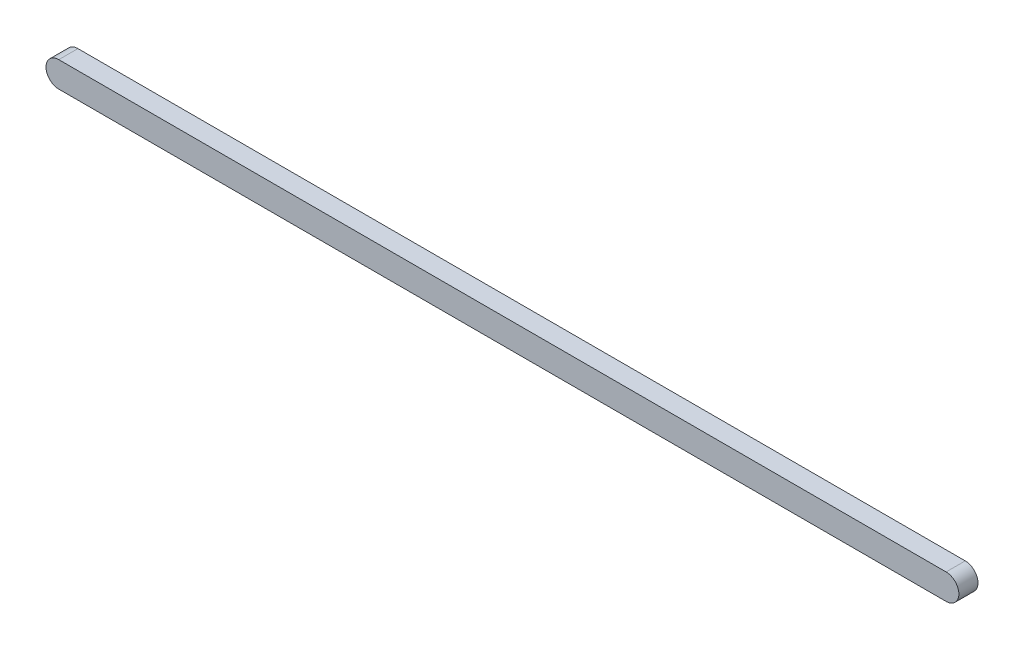
ISO-10303-21;
HEADER;
FILE_DESCRIPTION(('STEP AP214'),'2;1');
FILE_NAME('part.step','',(''),(''),'','','');
FILE_SCHEMA(('AUTOMOTIVE_DESIGN { 1 0 10303 214 1 1 1 1 }'));
ENDSEC;
DATA;
#1=APPLICATION_CONTEXT('core data for automotive mechanical design processes');
#2=APPLICATION_PROTOCOL_DEFINITION('international standard','automotive_design',2000,#1);
#3=PRODUCT_CONTEXT('',#1,'mechanical');
#4=PRODUCT('Part','Part','',(#3));
#5=PRODUCT_RELATED_PRODUCT_CATEGORY('part','',(#4));
#6=PRODUCT_DEFINITION_FORMATION('','',#4);
#7=PRODUCT_DEFINITION_CONTEXT('part definition',#1,'design');
#8=PRODUCT_DEFINITION('design','',#6,#7);
#9=PRODUCT_DEFINITION_SHAPE('','',#8);
#10=(LENGTH_UNIT() NAMED_UNIT(*) SI_UNIT(.MILLI.,.METRE.));
#11=(NAMED_UNIT(*) PLANE_ANGLE_UNIT() SI_UNIT($,.RADIAN.));
#12=(NAMED_UNIT(*) SI_UNIT($,.STERADIAN.) SOLID_ANGLE_UNIT());
#13=UNCERTAINTY_MEASURE_WITH_UNIT(LENGTH_MEASURE(1.E-05),#10,'distance_accuracy_value','');
#14=(GEOMETRIC_REPRESENTATION_CONTEXT(3) GLOBAL_UNCERTAINTY_ASSIGNED_CONTEXT((#13)) GLOBAL_UNIT_ASSIGNED_CONTEXT((#10,
#11,#12)) REPRESENTATION_CONTEXT('',''));
#15=CARTESIAN_POINT('',(0.,0.,0.));
#16=DIRECTION('',(0.,0.,1.));
#17=DIRECTION('',(1.,0.,0.));
#18=AXIS2_PLACEMENT_3D('',#15,#16,#17);
#19=CARTESIAN_POINT('',(0.,2.,3.));
#20=DIRECTION('',(0.,0.,-1.));
#21=DIRECTION('',(-1.,0.,0.));
#22=AXIS2_PLACEMENT_3D('',#19,#20,#21);
#23=CYLINDRICAL_SURFACE('',#22,2.);
#24=CARTESIAN_POINT('',(0.,2.,0.));
#25=DIRECTION('',(0.,0.,1.));
#26=DIRECTION('',(1.,0.,0.));
#27=AXIS2_PLACEMENT_3D('',#24,#25,#26);
#28=CIRCLE('',#27,2.);
#29=CARTESIAN_POINT('',(0.,4.,0.));
#30=VERTEX_POINT('',#29);
#31=CARTESIAN_POINT('',(0.,0.,0.));
#32=VERTEX_POINT('',#31);
#33=EDGE_CURVE('E101',#30,#32,#28,.T.);
#34=ORIENTED_EDGE('',*,*,#33,.T.);
#35=DIRECTION('',(0.,0.,-1.));
#36=VECTOR('',#35,1.);
#37=CARTESIAN_POINT('',(0.,0.,3.));
#38=LINE('',#37,#36);
#39=CARTESIAN_POINT('',(0.,0.,3.));
#40=VERTEX_POINT('',#39);
#41=EDGE_CURVE('E11',#40,#32,#38,.T.);
#42=ORIENTED_EDGE('',*,*,#41,.F.);
#43=CARTESIAN_POINT('',(0.,2.,3.));
#44=DIRECTION('',(0.,0.,1.));
#45=DIRECTION('',(1.,0.,0.));
#46=AXIS2_PLACEMENT_3D('',#43,#44,#45);
#47=CIRCLE('',#46,2.);
#48=CARTESIAN_POINT('',(0.,4.,3.));
#49=VERTEX_POINT('',#48);
#50=EDGE_CURVE('E88',#49,#40,#47,.T.);
#51=ORIENTED_EDGE('',*,*,#50,.F.);
#52=DIRECTION('',(0.,0.,-1.));
#53=VECTOR('',#52,1.);
#54=CARTESIAN_POINT('',(0.,4.,3.));
#55=LINE('',#54,#53);
#56=EDGE_CURVE('E97',#49,#30,#55,.T.);
#57=ORIENTED_EDGE('',*,*,#56,.T.);
#58=EDGE_LOOP('',(#34,#42,#51,#57));
#59=FACE_BOUND('',#58,.T.);
#60=ADVANCED_FACE('F35',(#59),#23,.T.);
#61=CARTESIAN_POINT('',(0.,0.,3.));
#62=DIRECTION('',(0.,1.,0.));
#63=DIRECTION('',(0.,0.,1.));
#64=AXIS2_PLACEMENT_3D('',#61,#62,#63);
#65=PLANE('',#64);
#66=DIRECTION('',(1.,0.,0.));
#67=VECTOR('',#66,1.);
#68=CARTESIAN_POINT('',(0.,0.,0.));
#69=LINE('',#68,#67);
#70=CARTESIAN_POINT('',(139.,0.,0.));
#71=VERTEX_POINT('',#70);
#72=EDGE_CURVE('E92',#32,#71,#69,.T.);
#73=ORIENTED_EDGE('',*,*,#72,.T.);
#74=DIRECTION('',(0.,0.,-1.));
#75=VECTOR('',#74,1.);
#76=CARTESIAN_POINT('',(139.,0.,3.));
#77=LINE('',#76,#75);
#78=CARTESIAN_POINT('',(139.,0.,3.));
#79=VERTEX_POINT('',#78);
#80=EDGE_CURVE('E44',#79,#71,#77,.T.);
#81=ORIENTED_EDGE('',*,*,#80,.F.);
#82=DIRECTION('',(1.,0.,0.));
#83=VECTOR('',#82,1.);
#84=CARTESIAN_POINT('',(0.,0.,3.));
#85=LINE('',#84,#83);
#86=EDGE_CURVE('E83',#40,#79,#85,.T.);
#87=ORIENTED_EDGE('',*,*,#86,.F.);
#88=ORIENTED_EDGE('',*,*,#41,.T.);
#89=EDGE_LOOP('',(#73,#81,#87,#88));
#90=FACE_BOUND('',#89,.T.);
#91=ADVANCED_FACE('F91',(#90),#65,.F.);
#92=CARTESIAN_POINT('',(139.,2.,3.));
#93=DIRECTION('',(0.,0.,-1.));
#94=DIRECTION('',(-1.,0.,0.));
#95=AXIS2_PLACEMENT_3D('',#92,#93,#94);
#96=CYLINDRICAL_SURFACE('',#95,2.);
#97=CARTESIAN_POINT('',(139.,2.,0.));
#98=DIRECTION('',(0.,0.,1.));
#99=DIRECTION('',(1.,0.,0.));
#100=AXIS2_PLACEMENT_3D('',#97,#98,#99);
#101=CIRCLE('',#100,2.);
#102=CARTESIAN_POINT('',(139.,4.,0.));
#103=VERTEX_POINT('',#102);
#104=EDGE_CURVE('E70',#71,#103,#101,.T.);
#105=ORIENTED_EDGE('',*,*,#104,.T.);
#106=DIRECTION('',(0.,0.,-1.));
#107=VECTOR('',#106,1.);
#108=CARTESIAN_POINT('',(139.,4.,3.));
#109=LINE('',#108,#107);
#110=CARTESIAN_POINT('',(139.,4.,3.));
#111=VERTEX_POINT('',#110);
#112=EDGE_CURVE('E93',#111,#103,#109,.T.);
#113=ORIENTED_EDGE('',*,*,#112,.F.);
#114=CARTESIAN_POINT('',(139.,2.,3.));
#115=DIRECTION('',(0.,0.,1.));
#116=DIRECTION('',(1.,0.,0.));
#117=AXIS2_PLACEMENT_3D('',#114,#115,#116);
#118=CIRCLE('',#117,2.);
#119=EDGE_CURVE('E86',#79,#111,#118,.T.);
#120=ORIENTED_EDGE('',*,*,#119,.F.);
#121=ORIENTED_EDGE('',*,*,#80,.T.);
#122=EDGE_LOOP('',(#105,#113,#120,#121));
#123=FACE_BOUND('',#122,.T.);
#124=ADVANCED_FACE('F95',(#123),#96,.T.);
#125=CARTESIAN_POINT('',(139.,4.,3.));
#126=DIRECTION('',(0.,-1.,0.));
#127=DIRECTION('',(1.,0.,0.));
#128=AXIS2_PLACEMENT_3D('',#125,#126,#127);
#129=PLANE('',#128);
#130=DIRECTION('',(-1.,0.,0.));
#131=VECTOR('',#130,1.);
#132=CARTESIAN_POINT('',(139.,4.,0.));
#133=LINE('',#132,#131);
#134=EDGE_CURVE('E76',#103,#30,#133,.T.);
#135=ORIENTED_EDGE('',*,*,#134,.T.);
#136=ORIENTED_EDGE('',*,*,#56,.F.);
#137=DIRECTION('',(-1.,0.,0.));
#138=VECTOR('',#137,1.);
#139=CARTESIAN_POINT('',(139.,4.,3.));
#140=LINE('',#139,#138);
#141=EDGE_CURVE('E53',#111,#49,#140,.T.);
#142=ORIENTED_EDGE('',*,*,#141,.F.);
#143=ORIENTED_EDGE('',*,*,#112,.T.);
#144=EDGE_LOOP('',(#135,#136,#142,#143));
#145=FACE_BOUND('',#144,.T.);
#146=ADVANCED_FACE('F125',(#145),#129,.F.);
#147=CARTESIAN_POINT('',(0.,2.,3.));
#148=DIRECTION('',(0.,0.,1.));
#149=DIRECTION('',(1.,0.,0.));
#150=AXIS2_PLACEMENT_3D('',#147,#148,#149);
#151=PLANE('',#150);
#152=ORIENTED_EDGE('',*,*,#50,.T.);
#153=ORIENTED_EDGE('',*,*,#86,.T.);
#154=ORIENTED_EDGE('',*,*,#119,.T.);
#155=ORIENTED_EDGE('',*,*,#141,.T.);
#156=EDGE_LOOP('',(#152,#153,#154,#155));
#157=FACE_BOUND('',#156,.T.);
#158=ADVANCED_FACE('F84',(#157),#151,.T.);
#159=CARTESIAN_POINT('',(0.,2.,0.));
#160=DIRECTION('',(0.,0.,1.));
#161=DIRECTION('',(1.,0.,0.));
#162=AXIS2_PLACEMENT_3D('',#159,#160,#161);
#163=PLANE('',#162);
#164=CARTESIAN_POINT('',(139.,2.,0.));
#165=DIRECTION('',(0.,0.,1.));
#166=DIRECTION('',(1.,0.,0.));
#167=AXIS2_PLACEMENT_3D('',#164,#165,#166);
#168=CIRCLE('',#167,0.866025403784429);
#169=CARTESIAN_POINT('',(139.866025403784,2.,0.));
#170=VERTEX_POINT('',#169);
#171=EDGE_CURVE('E38',#170,#170,#168,.F.);
#172=ORIENTED_EDGE('',*,*,#171,.F.);
#173=EDGE_LOOP('',(#172));
#174=FACE_BOUND('',#173,.T.);
#175=CARTESIAN_POINT('',(0.,2.,0.));
#176=DIRECTION('',(0.,0.,1.));
#177=DIRECTION('',(1.,0.,0.));
#178=AXIS2_PLACEMENT_3D('',#175,#176,#177);
#179=CIRCLE('',#178,0.866025403784439);
#180=CARTESIAN_POINT('',(0.866025403784439,2.,0.));
#181=VERTEX_POINT('',#180);
#182=EDGE_CURVE('E104',#181,#181,#179,.F.);
#183=ORIENTED_EDGE('',*,*,#182,.F.);
#184=EDGE_LOOP('',(#183));
#185=FACE_BOUND('',#184,.T.);
#186=ORIENTED_EDGE('',*,*,#33,.F.);
#187=ORIENTED_EDGE('',*,*,#134,.F.);
#188=ORIENTED_EDGE('',*,*,#104,.F.);
#189=ORIENTED_EDGE('',*,*,#72,.F.);
#190=EDGE_LOOP('',(#186,#187,#188,#189));
#191=FACE_BOUND('',#190,.T.);
#192=ADVANCED_FACE('F117',(#174,#185,#191),#163,.F.);
#193=CARTESIAN_POINT('',(0.,2.,0.5));
#194=DIRECTION('',(0.,0.,1.));
#195=DIRECTION('',(1.,0.,0.));
#196=AXIS2_PLACEMENT_3D('',#193,#194,#195);
#197=SPHERICAL_SURFACE('',#196,1.);
#198=ORIENTED_EDGE('',*,*,#182,.T.);
#199=EDGE_LOOP('',(#198));
#200=FACE_BOUND('',#199,.T.);
#201=ADVANCED_FACE('F120',(#200),#197,.F.);
#202=CARTESIAN_POINT('',(139.,2.,0.500000000000017));
#203=DIRECTION('',(0.,0.,1.));
#204=DIRECTION('',(1.,0.,0.));
#205=AXIS2_PLACEMENT_3D('',#202,#203,#204);
#206=SPHERICAL_SURFACE('',#205,1.);
#207=ORIENTED_EDGE('',*,*,#171,.T.);
#208=EDGE_LOOP('',(#207));
#209=FACE_BOUND('',#208,.T.);
#210=ADVANCED_FACE('F115',(#209),#206,.F.);
#211=CLOSED_SHELL('',(#60,#91,#124,#146,#158,#192,#201,#210));
#212=MANIFOLD_SOLID_BREP('B2',#211);
#213=ADVANCED_BREP_SHAPE_REPRESENTATION('',(#18,#212),#14);
#214=SHAPE_DEFINITION_REPRESENTATION(#9,#213);
ENDSEC;
END-ISO-10303-21;
